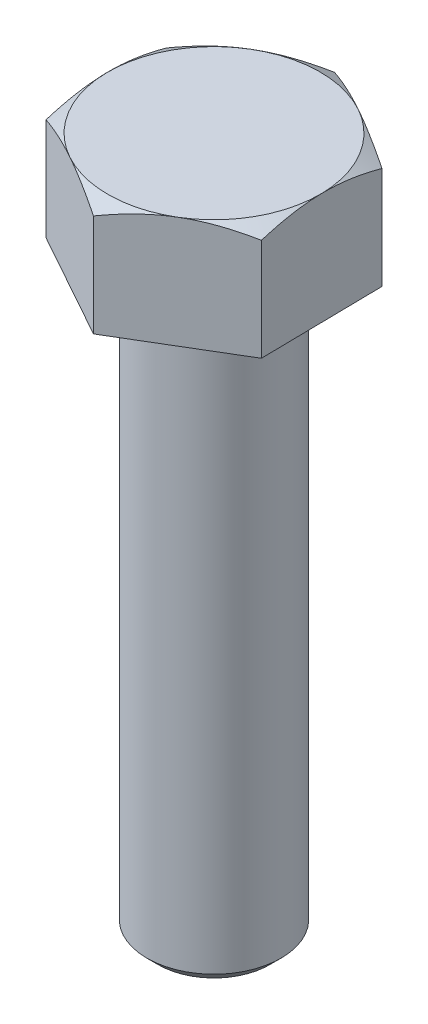
ISO-10303-21;
HEADER;
FILE_DESCRIPTION(('STEP AP214'),'2;1');
FILE_NAME('part.step','',(''),(''),'','','');
FILE_SCHEMA(('AUTOMOTIVE_DESIGN { 1 0 10303 214 1 1 1 1 }'));
ENDSEC;
DATA;
#1=APPLICATION_CONTEXT('core data for automotive mechanical design processes');
#2=APPLICATION_PROTOCOL_DEFINITION('international standard','automotive_design',2000,#1);
#3=PRODUCT_CONTEXT('',#1,'mechanical');
#4=PRODUCT('Part','Part','',(#3));
#5=PRODUCT_RELATED_PRODUCT_CATEGORY('part','',(#4));
#6=PRODUCT_DEFINITION_FORMATION('','',#4);
#7=PRODUCT_DEFINITION_CONTEXT('part definition',#1,'design');
#8=PRODUCT_DEFINITION('design','',#6,#7);
#9=PRODUCT_DEFINITION_SHAPE('','',#8);
#10=(LENGTH_UNIT() NAMED_UNIT(*) SI_UNIT(.MILLI.,.METRE.));
#11=(NAMED_UNIT(*) PLANE_ANGLE_UNIT() SI_UNIT($,.RADIAN.));
#12=(NAMED_UNIT(*) SI_UNIT($,.STERADIAN.) SOLID_ANGLE_UNIT());
#13=UNCERTAINTY_MEASURE_WITH_UNIT(LENGTH_MEASURE(1.E-05),#10,'distance_accuracy_value','');
#14=(GEOMETRIC_REPRESENTATION_CONTEXT(3) GLOBAL_UNCERTAINTY_ASSIGNED_CONTEXT((#13)) GLOBAL_UNIT_ASSIGNED_CONTEXT((#10,
#11,#12)) REPRESENTATION_CONTEXT('',''));
#15=CARTESIAN_POINT('',(0.,0.,0.));
#16=DIRECTION('',(0.,0.,1.));
#17=DIRECTION('',(1.,0.,0.));
#18=AXIS2_PLACEMENT_3D('',#15,#16,#17);
#19=CARTESIAN_POINT('',(0.173262347814132,10.,10.9682867163547));
#20=DIRECTION('',(-0.513616234425041,0.,-0.858020025252931));
#21=DIRECTION('',(-0.858020025252931,0.,0.513616234425041));
#22=AXIS2_PLACEMENT_3D('',#19,#20,#21);
#23=PLANE('',#22);
#24=CARTESIAN_POINT('',(0.173062347814132,9.15142693422508,10.9684064376245));
#25=CARTESIAN_POINT('',(0.379962741516676,9.22102596438326,10.8445545484063));
#26=CARTESIAN_POINT('',(0.587634567984237,9.28746612301292,10.7202408746375));
#27=CARTESIAN_POINT('',(1.00464359579951,9.41315220352887,10.4706166231235));
#28=CARTESIAN_POINT('',(1.21398132090291,9.47239575924445,10.345305731855));
#29=CARTESIAN_POINT('',(1.84536756822677,9.63818502077471,9.96735391572733));
#30=CARTESIAN_POINT('',(2.26990857494894,9.73248521216513,9.71322097382148));
#31=CARTESIAN_POINT('',(2.9052147574972,9.84306103598287,9.33292265958203));
#32=CARTESIAN_POINT('',(3.11408190838828,9.87455994336869,9.2078934570245));
#33=CARTESIAN_POINT('',(3.53278325536823,9.92738162471967,8.95725617251457));
#34=CARTESIAN_POINT('',(3.74261746999128,9.94870420282556,8.8316480794675));
#35=CARTESIAN_POINT('',(4.16263591942992,9.98062688939429,8.58022236906391));
#36=CARTESIAN_POINT('',(4.37281943958275,9.99123973986667,8.45440517950907));
#37=CARTESIAN_POINT('',(4.79338062734909,10.0015174586375,8.20265458249685));
#38=CARTESIAN_POINT('',(5.00375828876341,10.0011826651834,8.07672117875033));
#39=CARTESIAN_POINT('',(5.39706463451681,9.99032668992021,7.84128550319977));
#40=CARTESIAN_POINT('',(5.58002107805211,9.98112980288547,7.73176661456463));
#41=CARTESIAN_POINT('',(5.94550606922439,9.95463468405479,7.51298497849565));
#42=CARTESIAN_POINT('',(6.12803458567441,9.93733587917869,7.40372224973054));
#43=CARTESIAN_POINT('',(6.67491287959708,9.87369557628856,7.07635743102418));
#44=CARTESIAN_POINT('',(7.03829464318031,9.81561811884142,6.85883480034277));
#45=CARTESIAN_POINT('',(7.76891278231669,9.67042388406765,6.42148214378299));
#46=CARTESIAN_POINT('',(8.13605591494484,9.58269164706172,6.2017079337115));
#47=CARTESIAN_POINT('',(8.86486719183333,9.38357588040631,5.76543687636453));
#48=CARTESIAN_POINT('',(9.22654466877665,9.2722391164208,5.54893444248576));
#49=CARTESIAN_POINT('',(9.58564610626165,9.15142693422508,5.33397404218124));
#50=B_SPLINE_CURVE_WITH_KNOTS('',3,(#24,#25,#26,#27,#28,#29,#30,#31,#32,#33,#34,#35,#36,#37,#38,
#39,#40,#41,#42,#43,#44,#45,#46,#47,#48,#49),.UNSPECIFIED.,.F.,.F.,(4,2,2,2,2,2,2,2,2,2,2,2,4),
(0.,0.752880576986519,1.50600802735598,3.01546900018932,3.75167373176769,4.48789263217927,
5.22323457212509,5.95855379235702,6.59868189063848,7.23885527450938,8.52011176995212,
9.82978357664086,11.1368844914701),.UNSPECIFIED.);
#51=CARTESIAN_POINT('',(0.173262347814132,9.15149422396812,10.9682867163547));
#52=VERTEX_POINT('',#51);
#53=CARTESIAN_POINT('',(4.87935422703789,10.,8.15119023990285));
#54=VERTEX_POINT('',#53);
#55=EDGE_CURVE('E264',#52,#54,#50,.T.);
#56=ORIENTED_EDGE('',*,*,#55,.F.);
#57=DIRECTION('',(0.,-1.,0.));
#58=VECTOR('',#57,1.);
#59=CARTESIAN_POINT('',(0.173262347814132,10.,10.9682867163547));
#60=LINE('',#59,#58);
#61=CARTESIAN_POINT('',(0.173262347814132,0.,10.9682867163547));
#62=VERTEX_POINT('',#61);
#63=EDGE_CURVE('E247',#52,#62,#60,.T.);
#64=ORIENTED_EDGE('',*,*,#63,.T.);
#65=DIRECTION('',(0.858020025252931,0.,-0.513616234425041));
#66=VECTOR('',#65,1.);
#67=CARTESIAN_POINT('',(0.173262347814132,0.,10.9682867163547));
#68=LINE('',#67,#66);
#69=CARTESIAN_POINT('',(9.58544610626165,0.,5.33409376345098));
#70=VERTEX_POINT('',#69);
#71=EDGE_CURVE('E262',#62,#70,#68,.T.);
#72=ORIENTED_EDGE('',*,*,#71,.T.);
#73=DIRECTION('',(0.,-1.,0.));
#74=VECTOR('',#73,1.);
#75=CARTESIAN_POINT('',(9.58544610626165,10.,5.33409376345098));
#76=LINE('',#75,#74);
#77=CARTESIAN_POINT('',(9.58544610626165,9.15149422396812,5.33409376345098));
#78=VERTEX_POINT('',#77);
#79=EDGE_CURVE('E236',#78,#70,#76,.T.);
#80=ORIENTED_EDGE('',*,*,#79,.F.);
#81=EDGE_CURVE('E116',#54,#78,#50,.T.);
#82=ORIENTED_EDGE('',*,*,#81,.F.);
#83=EDGE_LOOP('',(#56,#64,#72,#80,#82));
#84=FACE_BOUND('',#83,.T.);
#85=ADVANCED_FACE('F40',(#84),#23,.F.);
#86=CARTESIAN_POINT('',(9.58544610626165,10.,5.33409376345098));
#87=DIRECTION('',(-0.999875256037325,0.,0.0157946941817238));
#88=DIRECTION('',(0.0157946941817238,0.,0.999875256037325));
#89=AXIS2_PLACEMENT_3D('',#86,#87,#88);
#90=PLANE('',#89);
#91=CARTESIAN_POINT('',(9.58544926559459,9.15143648094854,5.33429376345098));
#92=CARTESIAN_POINT('',(9.58164058447453,9.22103511610949,5.09318710027226));
#93=CARTESIAN_POINT('',(9.57781770260655,9.28747487018941,4.85118146581229));
#94=CARTESIAN_POINT('',(9.57014128223299,9.41316012408747,4.36522949370347));
#95=CARTESIAN_POINT('',(9.56628773408599,9.47240325773065,4.12128254570937));
#96=CARTESIAN_POINT('',(9.55466499762388,9.63819122352982,3.38551099722605));
#97=CARTESIAN_POINT('',(9.54684992710142,9.73249051890971,2.89078184643059));
#98=CARTESIAN_POINT('',(9.5351550319087,9.84306500762035,2.15044232541103));
#99=CARTESIAN_POINT('',(9.53131014626852,9.87456347834013,1.90704375310096));
#100=CARTESIAN_POINT('',(9.52360257359658,9.92738429049192,1.41911970024372));
#101=CARTESIAN_POINT('',(9.51973988622363,9.94870643605982,1.17459419809794));
#102=CARTESIAN_POINT('',(9.51200806843451,9.98062827285205,0.685135320161817));
#103=CARTESIAN_POINT('',(9.50813895117355,9.99124070591221,0.440202777155754));
#104=CARTESIAN_POINT('',(9.50039714301958,10.0015176151139,-0.0498885358562121));
#105=CARTESIAN_POINT('',(9.49652445224067,10.0011824295156,-0.295047298638313));
#106=CARTESIAN_POINT('',(9.48928439327191,9.9903258049719,-0.753375629141634));
#107=CARTESIAN_POINT('',(9.48591651401775,9.98112873985218,-0.966577549534346));
#108=CARTESIAN_POINT('',(9.47918863230238,9.95463345763731,-1.39248275386086));
#109=CARTESIAN_POINT('',(9.47582863041525,9.93733466749521,-1.60518600145308));
#110=CARTESIAN_POINT('',(9.46576164406384,9.87369468921491,-2.24247156328983));
#111=CARTESIAN_POINT('',(9.45907247879381,9.81561782212762,-2.665925842309));
#112=CARTESIAN_POINT('',(9.44562319355357,9.67042543153226,-3.51732615233592));
#113=CARTESIAN_POINT('',(9.43886478995831,9.58269447209229,-3.94516352908191));
#114=CARTESIAN_POINT('',(9.42544876533842,9.38358174595555,-4.79445829208811));
#115=CARTESIAN_POINT('',(9.41879097252436,9.27224674251197,-5.21592655339163));
#116=CARTESIAN_POINT('',(9.41218059911457,9.15143648094854,-5.63439295290374));
#117=B_SPLINE_CURVE_WITH_KNOTS('',3,(#91,#92,#93,#94,#95,#96,#97,#98,#99,#100,#101,#102,#103,
#104,#105,#106,#107,#108,#109,#110,#111,#112,#113,#114,#115,#116),.UNSPECIFIED.,.F.,.F.,(4,2,2,
2,2,2,2,2,2,2,2,2,4),(0.,0.752879445569665,1.50600576400105,3.01546441053545,3.7516681180122,
4.487885994658,5.2232269228263,5.95854513041304,6.59866590824933,7.23883196961019,
8.52007377521222,9.82973011484263,11.1368156722817),.UNSPECIFIED.);
#118=CARTESIAN_POINT('',(9.49881493235459,10.,-0.150049594726377));
#119=VERTEX_POINT('',#118);
#120=EDGE_CURVE('E112',#78,#119,#117,.T.);
#121=ORIENTED_EDGE('',*,*,#120,.F.);
#122=ORIENTED_EDGE('',*,*,#79,.T.);
#123=DIRECTION('',(-0.0157946941817238,0.,-0.999875256037325));
#124=VECTOR('',#123,1.);
#125=CARTESIAN_POINT('',(9.58544610626165,0.,5.33409376345098));
#126=LINE('',#125,#124);
#127=CARTESIAN_POINT('',(9.41218375844751,0.,-5.63419295290374));
#128=VERTEX_POINT('',#127);
#129=EDGE_CURVE('E261',#70,#128,#126,.T.);
#130=ORIENTED_EDGE('',*,*,#129,.T.);
#131=DIRECTION('',(0.,-1.,0.));
#132=VECTOR('',#131,1.);
#133=CARTESIAN_POINT('',(9.41218375844751,10.,-5.63419295290374));
#134=LINE('',#133,#132);
#135=CARTESIAN_POINT('',(9.41218375844751,9.15149422396812,-5.63419295290374));
#136=VERTEX_POINT('',#135);
#137=EDGE_CURVE('E140',#136,#128,#134,.T.);
#138=ORIENTED_EDGE('',*,*,#137,.F.);
#139=EDGE_CURVE('E120',#119,#136,#117,.T.);
#140=ORIENTED_EDGE('',*,*,#139,.F.);
#141=EDGE_LOOP('',(#121,#122,#130,#138,#140));
#142=FACE_BOUND('',#141,.T.);
#143=ADVANCED_FACE('F138',(#142),#90,.F.);
#144=CARTESIAN_POINT('',(9.41218375844751,10.,-5.63419295290374));
#145=DIRECTION('',(-0.486259021612283,0.,0.873814719434655));
#146=DIRECTION('',(0.873814719434655,0.,0.486259021612283));
#147=AXIS2_PLACEMENT_3D('',#144,#145,#146);
#148=PLANE('',#147);
#149=CARTESIAN_POINT('',(9.41238375844751,9.15142815054419,-5.63408165722267));
#150=CARTESIAN_POINT('',(9.20167471022813,9.22102713037708,-5.75133669236136));
#151=CARTESIAN_POINT('',(8.99018002862632,9.28746723746441,-5.86902891551187));
#152=CARTESIAN_POINT('',(8.56549463445454,9.41315321266372,-6.1053571664214));
#153=CARTESIAN_POINT('',(8.35230338848769,9.47239671460446,-6.22399349100427));
#154=CARTESIAN_POINT('',(7.70929448967796,9.6381858110499,-6.58181405761764));
#155=CARTESIAN_POINT('',(7.27693847137902,9.73248588828258,-6.82241084520923));
#156=CARTESIAN_POINT('',(6.62993748243662,9.8430615419987,-7.18245292377351));
#157=CARTESIAN_POINT('',(6.41722547339015,9.87456039375033,-7.30082256335916));
#158=CARTESIAN_POINT('',(5.99081661034819,9.92738196435948,-7.53810988747718));
#159=CARTESIAN_POINT('',(5.77711973747732,9.94870448735711,-7.65702758251329));
#160=CARTESIAN_POINT('',(5.3493695299224,9.98062706565855,-7.89506133588686));
#161=CARTESIAN_POINT('',(5.13531692305321,9.99123986294978,-8.01417698921108));
#162=CARTESIAN_POINT('',(4.70701398999777,10.001517478576,-8.25251832238976));
#163=CARTESIAN_POINT('',(4.49276367012479,10.0011826351601,-8.37174399873103));
#164=CARTESIAN_POINT('',(4.09221753237682,9.99032657717369,-8.59463927472033));
#165=CARTESIAN_POINT('',(3.90589344385083,9.98112966744938,-8.69832460637516));
#166=CARTESIAN_POINT('',(3.53368103921688,9.95463452780185,-8.90545277174454));
#167=CARTESIAN_POINT('',(3.34779275486982,9.93733572480273,-9.00889558778484));
#168=CARTESIAN_POINT('',(2.79084817618177,9.87369546326955,-9.31882321878233));
#169=CARTESIAN_POINT('',(2.42077771310676,9.81561808103811,-9.52475943992871));
#170=CARTESIAN_POINT('',(1.67671123342427,9.67042408122527,-9.9388163679912));
#171=CARTESIAN_POINT('',(1.30281017569789,9.58269200699015,-10.1468842323406));
#172=CARTESIAN_POINT('',(0.560583814947694,9.38357662771809,-10.5599171739541));
#173=CARTESIAN_POINT('',(0.192249007508687,9.27224008803796,-10.7648875402199));
#174=CARTESIAN_POINT('',(-0.173462347814133,9.15142815054419,-10.9683980120358));
#175=B_SPLINE_CURVE_WITH_KNOTS('',3,(#149,#150,#151,#152,#153,#154,#155,#156,#157,#158,#159,
#160,#161,#162,#163,#164,#165,#166,#167,#168,#169,#170,#171,#172,#173,#174),.UNSPECIFIED.,.F.,
.F.,(4,2,2,2,2,2,2,2,2,2,2,2,4),(0.,0.752880432836143,1.50600773898882,3.01546841543549,
3.75167301653617,4.48789178651286,5.22323359755117,5.95855268876504,6.59867985437287,
7.23885230530706,8.52010692916586,9.82977676524726,11.1368757234418),.UNSPECIFIED.);
#176=CARTESIAN_POINT('',(4.61946070531669,10.,-8.30123983462922));
#177=VERTEX_POINT('',#176);
#178=EDGE_CURVE('E127',#136,#177,#175,.T.);
#179=ORIENTED_EDGE('',*,*,#178,.F.);
#180=ORIENTED_EDGE('',*,*,#137,.T.);
#181=DIRECTION('',(-0.873814719434655,0.,-0.486259021612283));
#182=VECTOR('',#181,1.);
#183=CARTESIAN_POINT('',(9.41218375844751,0.,-5.63419295290374));
#184=LINE('',#183,#182);
#185=CARTESIAN_POINT('',(-0.173262347814132,0.,-10.9682867163547));
#186=VERTEX_POINT('',#185);
#187=EDGE_CURVE('E258',#128,#186,#184,.T.);
#188=ORIENTED_EDGE('',*,*,#187,.T.);
#189=DIRECTION('',(0.,-1.,0.));
#190=VECTOR('',#189,1.);
#191=CARTESIAN_POINT('',(-0.173262347814132,10.,-10.9682867163547));
#192=LINE('',#191,#190);
#193=CARTESIAN_POINT('',(-0.173262347814132,9.15149422396812,-10.9682867163547));
#194=VERTEX_POINT('',#193);
#195=EDGE_CURVE('E241',#194,#186,#192,.T.);
#196=ORIENTED_EDGE('',*,*,#195,.F.);
#197=EDGE_CURVE('E141',#177,#194,#175,.T.);
#198=ORIENTED_EDGE('',*,*,#197,.F.);
#199=EDGE_LOOP('',(#179,#180,#188,#196,#198));
#200=FACE_BOUND('',#199,.T.);
#201=ADVANCED_FACE('F201',(#200),#148,.F.);
#202=CARTESIAN_POINT('',(-0.173262347814132,10.,-10.9682867163547));
#203=DIRECTION('',(0.513616234425041,0.,0.858020025252931));
#204=DIRECTION('',(0.858020025252932,0.,-0.513616234425041));
#205=AXIS2_PLACEMENT_3D('',#202,#203,#204);
#206=PLANE('',#205);
#207=CARTESIAN_POINT('',(-0.173062347814132,9.15142693422508,-10.9684064376245));
#208=CARTESIAN_POINT('',(-0.379962741516677,9.22102596438325,-10.8445545484063));
#209=CARTESIAN_POINT('',(-0.587634567984237,9.28746612301292,-10.7202408746375));
#210=CARTESIAN_POINT('',(-1.00464359579951,9.41315220352887,-10.4706166231235));
#211=CARTESIAN_POINT('',(-1.21398132090291,9.47239575924445,-10.345305731855));
#212=CARTESIAN_POINT('',(-1.84536756822677,9.6381850207747,-9.96735391572733));
#213=CARTESIAN_POINT('',(-2.26990857494894,9.73248521216513,-9.71322097382148));
#214=CARTESIAN_POINT('',(-2.9052147574972,9.84306103598287,-9.33292265958203));
#215=CARTESIAN_POINT('',(-3.11408190838828,9.87455994336869,-9.2078934570245));
#216=CARTESIAN_POINT('',(-3.53278325536823,9.92738162471967,-8.95725617251457));
#217=CARTESIAN_POINT('',(-3.74261746999128,9.94870420282556,-8.8316480794675));
#218=CARTESIAN_POINT('',(-4.16263591942992,9.98062688939429,-8.58022236906391));
#219=CARTESIAN_POINT('',(-4.37281943958275,9.99123973986667,-8.45440517950907));
#220=CARTESIAN_POINT('',(-4.79338062734909,10.0015174586375,-8.20265458249685));
#221=CARTESIAN_POINT('',(-5.00375828876341,10.0011826651834,-8.07672117875033));
#222=CARTESIAN_POINT('',(-5.39706463451681,9.99032668992021,-7.84128550319977));
#223=CARTESIAN_POINT('',(-5.58002107805211,9.98112980288547,-7.73176661456463));
#224=CARTESIAN_POINT('',(-5.9455060692244,9.95463468405479,-7.51298497849566));
#225=CARTESIAN_POINT('',(-6.12803458567441,9.93733587917869,-7.40372224973054));
#226=CARTESIAN_POINT('',(-6.67491287959708,9.87369557628856,-7.07635743102418));
#227=CARTESIAN_POINT('',(-7.03829464318032,9.81561811884141,-6.85883480034277));
#228=CARTESIAN_POINT('',(-7.7689127823167,9.67042388406765,-6.42148214378299));
#229=CARTESIAN_POINT('',(-8.13605591494485,9.58269164706172,-6.2017079337115));
#230=CARTESIAN_POINT('',(-8.86486719183333,9.38357588040631,-5.76543687636453));
#231=CARTESIAN_POINT('',(-9.22654466877666,9.2722391164208,-5.54893444248576));
#232=CARTESIAN_POINT('',(-9.58564610626166,9.15142693422508,-5.33397404218124));
#233=B_SPLINE_CURVE_WITH_KNOTS('',3,(#207,#208,#209,#210,#211,#212,#213,#214,#215,#216,#217,
#218,#219,#220,#221,#222,#223,#224,#225,#226,#227,#228,#229,#230,#231,#232),.UNSPECIFIED.,.F.,
.F.,(4,2,2,2,2,2,2,2,2,2,2,2,4),(0.,0.752880576986519,1.50600802735598,3.01546900018932,
3.75167373176769,4.48789263217928,5.22323457212509,5.95855379235702,6.59868189063848,
7.23885527450938,8.52011176995212,9.82978357664086,11.1368844914701),.UNSPECIFIED.);
#234=CARTESIAN_POINT('',(-4.87935422703789,10.,-8.15119023990285));
#235=VERTEX_POINT('',#234);
#236=EDGE_CURVE('E195',#194,#235,#233,.T.);
#237=ORIENTED_EDGE('',*,*,#236,.F.);
#238=ORIENTED_EDGE('',*,*,#195,.T.);
#239=DIRECTION('',(-0.858020025252931,0.,0.513616234425041));
#240=VECTOR('',#239,1.);
#241=CARTESIAN_POINT('',(-0.173262347814132,0.,-10.9682867163547));
#242=LINE('',#241,#240);
#243=CARTESIAN_POINT('',(-9.58544610626166,0.,-5.33409376345098));
#244=VERTEX_POINT('',#243);
#245=EDGE_CURVE('E255',#186,#244,#242,.T.);
#246=ORIENTED_EDGE('',*,*,#245,.T.);
#247=DIRECTION('',(0.,-1.,0.));
#248=VECTOR('',#247,1.);
#249=CARTESIAN_POINT('',(-9.58544610626166,10.,-5.33409376345098));
#250=LINE('',#249,#248);
#251=CARTESIAN_POINT('',(-9.58544610626166,9.15149422396812,-5.33409376345098));
#252=VERTEX_POINT('',#251);
#253=EDGE_CURVE('E243',#252,#244,#250,.T.);
#254=ORIENTED_EDGE('',*,*,#253,.F.);
#255=EDGE_CURVE('E189',#235,#252,#233,.T.);
#256=ORIENTED_EDGE('',*,*,#255,.F.);
#257=EDGE_LOOP('',(#237,#238,#246,#254,#256));
#258=FACE_BOUND('',#257,.T.);
#259=ADVANCED_FACE('F197',(#258),#206,.F.);
#260=CARTESIAN_POINT('',(-9.58544610626166,10.,-5.33409376345098));
#261=DIRECTION('',(0.999875256037325,0.,-0.0157946941817239));
#262=DIRECTION('',(-0.0157946941817238,0.,-0.999875256037325));
#263=AXIS2_PLACEMENT_3D('',#260,#261,#262);
#264=PLANE('',#263);
#265=CARTESIAN_POINT('',(-9.5854492655946,9.15143648094854,-5.33429376345098));
#266=CARTESIAN_POINT('',(-9.58164058447454,9.22103511610948,-5.09318710027226));
#267=CARTESIAN_POINT('',(-9.57781770260656,9.2874748701894,-4.85118146581229));
#268=CARTESIAN_POINT('',(-9.570141282233,9.41316012408746,-4.36522949370347));
#269=CARTESIAN_POINT('',(-9.566287734086,9.47240325773064,-4.12128254570938));
#270=CARTESIAN_POINT('',(-9.55466499762389,9.63819122352981,-3.38551099722605));
#271=CARTESIAN_POINT('',(-9.54684992710142,9.73249051890971,-2.89078184643059));
#272=CARTESIAN_POINT('',(-9.53515503190871,9.84306500762035,-2.15044232541103));
#273=CARTESIAN_POINT('',(-9.53131014626853,9.87456347834013,-1.90704375310095));
#274=CARTESIAN_POINT('',(-9.52360257359659,9.92738429049192,-1.41911970024372));
#275=CARTESIAN_POINT('',(-9.51973988622363,9.94870643605981,-1.17459419809794));
#276=CARTESIAN_POINT('',(-9.51200806843451,9.98062827285204,-0.685135320161816));
#277=CARTESIAN_POINT('',(-9.50813895117356,9.99124070591221,-0.440202777155752));
#278=CARTESIAN_POINT('',(-9.50039714301959,10.0015176151139,0.0498885358562139));
#279=CARTESIAN_POINT('',(-9.49652445224068,10.0011824295156,0.295047298638315));
#280=CARTESIAN_POINT('',(-9.48928439327192,9.9903258049719,0.753375629141636));
#281=CARTESIAN_POINT('',(-9.48591651401775,9.98112873985218,0.966577549534348));
#282=CARTESIAN_POINT('',(-9.47918863230239,9.9546334576373,1.39248275386086));
#283=CARTESIAN_POINT('',(-9.47582863041526,9.93733466749521,1.60518600145308));
#284=CARTESIAN_POINT('',(-9.46576164406385,9.87369468921491,2.24247156328983));
#285=CARTESIAN_POINT('',(-9.45907247879381,9.81561782212762,2.665925842309));
#286=CARTESIAN_POINT('',(-9.44562319355358,9.67042543153226,3.51732615233592));
#287=CARTESIAN_POINT('',(-9.43886478995832,9.58269447209229,3.94516352908191));
#288=CARTESIAN_POINT('',(-9.42544876533842,9.38358174595555,4.79445829208811));
#289=CARTESIAN_POINT('',(-9.41879097252437,9.27224674251196,5.21592655339163));
#290=CARTESIAN_POINT('',(-9.41218059911458,9.15143648094854,5.63439295290373));
#291=B_SPLINE_CURVE_WITH_KNOTS('',3,(#265,#266,#267,#268,#269,#270,#271,#272,#273,#274,#275,
#276,#277,#278,#279,#280,#281,#282,#283,#284,#285,#286,#287,#288,#289,#290),.UNSPECIFIED.,.F.,
.F.,(4,2,2,2,2,2,2,2,2,2,2,2,4),(0.,0.752879445569664,1.50600576400105,3.01546441053545,
3.7516681180122,4.48788599465801,5.2232269228263,5.95854513041304,6.59866590824933,
7.23883196961019,8.52007377521222,9.82973011484263,11.1368156722817),.UNSPECIFIED.);
#292=CARTESIAN_POINT('',(-9.49881493235459,10.,0.150049594726377));
#293=VERTEX_POINT('',#292);
#294=EDGE_CURVE('E196',#252,#293,#291,.T.);
#295=ORIENTED_EDGE('',*,*,#294,.F.);
#296=ORIENTED_EDGE('',*,*,#253,.T.);
#297=DIRECTION('',(0.0157946941817239,0.,0.999875256037325));
#298=VECTOR('',#297,1.);
#299=CARTESIAN_POINT('',(-9.58544610626166,0.,-5.33409376345098));
#300=LINE('',#299,#298);
#301=CARTESIAN_POINT('',(-9.41218375844752,0.,5.63419295290373));
#302=VERTEX_POINT('',#301);
#303=EDGE_CURVE('E252',#244,#302,#300,.T.);
#304=ORIENTED_EDGE('',*,*,#303,.T.);
#305=DIRECTION('',(0.,-1.,0.));
#306=VECTOR('',#305,1.);
#307=CARTESIAN_POINT('',(-9.41218375844752,10.,5.63419295290373));
#308=LINE('',#307,#306);
#309=CARTESIAN_POINT('',(-9.41218375844752,9.15149422396812,5.63419295290373));
#310=VERTEX_POINT('',#309);
#311=EDGE_CURVE('E245',#310,#302,#308,.T.);
#312=ORIENTED_EDGE('',*,*,#311,.F.);
#313=EDGE_CURVE('E182',#293,#310,#291,.T.);
#314=ORIENTED_EDGE('',*,*,#313,.F.);
#315=EDGE_LOOP('',(#295,#296,#304,#312,#314));
#316=FACE_BOUND('',#315,.T.);
#317=ADVANCED_FACE('F200',(#316),#264,.F.);
#318=CARTESIAN_POINT('',(-9.41218375844752,10.,5.63419295290373));
#319=DIRECTION('',(0.486259021612283,0.,-0.873814719434655));
#320=DIRECTION('',(-0.873814719434655,0.,-0.486259021612283));
#321=AXIS2_PLACEMENT_3D('',#318,#319,#320);
#322=PLANE('',#321);
#323=CARTESIAN_POINT('',(-9.41238375844752,9.15142815054419,5.63408165722267));
#324=CARTESIAN_POINT('',(-9.20167471022814,9.22102713037708,5.75133669236136));
#325=CARTESIAN_POINT('',(-8.99018002862632,9.28746723746441,5.86902891551186));
#326=CARTESIAN_POINT('',(-8.56549463445455,9.41315321266372,6.10535716642139));
#327=CARTESIAN_POINT('',(-8.3523033884877,9.47239671460446,6.22399349100427));
#328=CARTESIAN_POINT('',(-7.70929448967796,9.6381858110499,6.58181405761764));
#329=CARTESIAN_POINT('',(-7.27693847137902,9.73248588828258,6.82241084520923));
#330=CARTESIAN_POINT('',(-6.62993748243662,9.8430615419987,7.1824529237735));
#331=CARTESIAN_POINT('',(-6.41722547339015,9.87456039375033,7.30082256335916));
#332=CARTESIAN_POINT('',(-5.99081661034819,9.92738196435948,7.53810988747718));
#333=CARTESIAN_POINT('',(-5.77711973747732,9.94870448735711,7.65702758251329));
#334=CARTESIAN_POINT('',(-5.34936952992241,9.98062706565855,7.89506133588686));
#335=CARTESIAN_POINT('',(-5.13531692305321,9.99123986294978,8.01417698921107));
#336=CARTESIAN_POINT('',(-4.70701398999777,10.001517478576,8.25251832238976));
#337=CARTESIAN_POINT('',(-4.49276367012479,10.0011826351601,8.37174399873103));
#338=CARTESIAN_POINT('',(-4.09221753237682,9.9903265771737,8.59463927472033));
#339=CARTESIAN_POINT('',(-3.90589344385083,9.98112966744938,8.69832460637516));
#340=CARTESIAN_POINT('',(-3.53368103921688,9.95463452780185,8.90545277174454));
#341=CARTESIAN_POINT('',(-3.34779275486982,9.93733572480273,9.00889558778484));
#342=CARTESIAN_POINT('',(-2.79084817618178,9.87369546326955,9.31882321878232));
#343=CARTESIAN_POINT('',(-2.42077771310677,9.81561808103812,9.5247594399287));
#344=CARTESIAN_POINT('',(-1.67671123342427,9.67042408122527,9.9388163679912));
#345=CARTESIAN_POINT('',(-1.3028101756979,9.58269200699015,10.1468842323406));
#346=CARTESIAN_POINT('',(-0.560583814947695,9.3835766277181,10.559917173954));
#347=CARTESIAN_POINT('',(-0.192249007508689,9.27224008803796,10.7648875402199));
#348=CARTESIAN_POINT('',(0.173462347814132,9.15142815054419,10.9683980120358));
#349=B_SPLINE_CURVE_WITH_KNOTS('',3,(#323,#324,#325,#326,#327,#328,#329,#330,#331,#332,#333,
#334,#335,#336,#337,#338,#339,#340,#341,#342,#343,#344,#345,#346,#347,#348),.UNSPECIFIED.,.F.,
.F.,(4,2,2,2,2,2,2,2,2,2,2,2,4),(0.,0.752880432836145,1.50600773898882,3.0154684154355,
3.75167301653618,4.48789178651286,5.22323359755117,5.95855268876504,6.59867985437287,
7.23885230530707,8.52010692916587,9.82977676524727,11.1368757234418),.UNSPECIFIED.);
#350=CARTESIAN_POINT('',(-4.61946070531669,10.,8.30123983462922));
#351=VERTEX_POINT('',#350);
#352=EDGE_CURVE('E290',#310,#351,#349,.T.);
#353=ORIENTED_EDGE('',*,*,#352,.F.);
#354=ORIENTED_EDGE('',*,*,#311,.T.);
#355=DIRECTION('',(0.873814719434655,0.,0.486259021612283));
#356=VECTOR('',#355,1.);
#357=CARTESIAN_POINT('',(-9.41218375844752,0.,5.63419295290373));
#358=LINE('',#357,#356);
#359=EDGE_CURVE('E249',#302,#62,#358,.T.);
#360=ORIENTED_EDGE('',*,*,#359,.T.);
#361=ORIENTED_EDGE('',*,*,#63,.F.);
#362=EDGE_CURVE('E135',#351,#52,#349,.T.);
#363=ORIENTED_EDGE('',*,*,#362,.F.);
#364=EDGE_LOOP('',(#353,#354,#360,#361,#363));
#365=FACE_BOUND('',#364,.T.);
#366=ADVANCED_FACE('F222',(#365),#322,.F.);
#367=CARTESIAN_POINT('',(0.,-52.,0.));
#368=DIRECTION('',(0.,1.,0.));
#369=DIRECTION('',(0.,0.,1.));
#370=AXIS2_PLACEMENT_3D('',#367,#368,#369);
#371=CYLINDRICAL_SURFACE('',#370,6.);
#372=CARTESIAN_POINT('',(0.,-51.,0.));
#373=DIRECTION('',(0.,1.,0.));
#374=DIRECTION('',(0.,0.,1.));
#375=AXIS2_PLACEMENT_3D('',#372,#373,#374);
#376=CIRCLE('',#375,6.);
#377=CARTESIAN_POINT('',(0.,-51.,6.));
#378=VERTEX_POINT('',#377);
#379=EDGE_CURVE('E49',#378,#378,#376,.T.);
#380=ORIENTED_EDGE('',*,*,#379,.T.);
#381=EDGE_LOOP('',(#380));
#382=FACE_BOUND('',#381,.T.);
#383=CARTESIAN_POINT('',(0.,0.,0.));
#384=DIRECTION('',(0.,1.,0.));
#385=DIRECTION('',(0.,0.,1.));
#386=AXIS2_PLACEMENT_3D('',#383,#384,#385);
#387=CIRCLE('',#386,6.);
#388=CARTESIAN_POINT('',(0.,0.,6.));
#389=VERTEX_POINT('',#388);
#390=EDGE_CURVE('E234',#389,#389,#387,.T.);
#391=ORIENTED_EDGE('',*,*,#390,.F.);
#392=EDGE_LOOP('',(#391));
#393=FACE_BOUND('',#392,.T.);
#394=ADVANCED_FACE('F219',(#382,#393),#371,.T.);
#395=CARTESIAN_POINT('',(0.,-52.,0.));
#396=DIRECTION('',(0.,1.,0.));
#397=DIRECTION('',(0.,0.,1.));
#398=AXIS2_PLACEMENT_3D('',#395,#396,#397);
#399=PLANE('',#398);
#400=CARTESIAN_POINT('',(0.,-52.,0.));
#401=DIRECTION('',(0.,1.,0.));
#402=DIRECTION('',(0.,0.,1.));
#403=AXIS2_PLACEMENT_3D('',#400,#401,#402);
#404=CIRCLE('',#403,4.99999999999998);
#405=CARTESIAN_POINT('',(0.,-52.,4.99999999999998));
#406=VERTEX_POINT('',#405);
#407=EDGE_CURVE('E13',#406,#406,#404,.F.);
#408=ORIENTED_EDGE('',*,*,#407,.T.);
#409=EDGE_LOOP('',(#408));
#410=FACE_BOUND('',#409,.T.);
#411=ADVANCED_FACE('F217',(#410),#399,.F.);
#412=CARTESIAN_POINT('',(0.,0.,0.));
#413=DIRECTION('',(0.,1.,0.));
#414=DIRECTION('',(0.,0.,1.));
#415=AXIS2_PLACEMENT_3D('',#412,#413,#414);
#416=PLANE('',#415);
#417=ORIENTED_EDGE('',*,*,#390,.T.);
#418=EDGE_LOOP('',(#417));
#419=FACE_BOUND('',#418,.T.);
#420=ORIENTED_EDGE('',*,*,#71,.F.);
#421=ORIENTED_EDGE('',*,*,#359,.F.);
#422=ORIENTED_EDGE('',*,*,#303,.F.);
#423=ORIENTED_EDGE('',*,*,#245,.F.);
#424=ORIENTED_EDGE('',*,*,#187,.F.);
#425=ORIENTED_EDGE('',*,*,#129,.F.);
#426=EDGE_LOOP('',(#420,#421,#422,#423,#424,#425));
#427=FACE_BOUND('',#426,.T.);
#428=ADVANCED_FACE('F168',(#419,#427),#416,.F.);
#429=CARTESIAN_POINT('',(0.,10.,0.));
#430=DIRECTION('',(0.,-1.,0.));
#431=DIRECTION('',(0.,0.,1.));
#432=AXIS2_PLACEMENT_3D('',#429,#430,#431);
#433=CONICAL_SURFACE('',#432,9.5,1.0471975511966);
#434=ORIENTED_EDGE('',*,*,#55,.T.);
#435=CARTESIAN_POINT('',(0.,10.,0.));
#436=DIRECTION('',(0.,1.,0.));
#437=DIRECTION('',(0.,0.,1.));
#438=AXIS2_PLACEMENT_3D('',#435,#436,#437);
#439=CIRCLE('',#438,9.5);
#440=EDGE_CURVE('E133',#351,#54,#439,.T.);
#441=ORIENTED_EDGE('',*,*,#440,.F.);
#442=ORIENTED_EDGE('',*,*,#362,.T.);
#443=EDGE_LOOP('',(#434,#441,#442));
#444=FACE_BOUND('',#443,.T.);
#445=ADVANCED_FACE('F163',(#444),#433,.T.);
#446=ORIENTED_EDGE('',*,*,#313,.T.);
#447=ORIENTED_EDGE('',*,*,#352,.T.);
#448=EDGE_CURVE('E64',#293,#351,#439,.T.);
#449=ORIENTED_EDGE('',*,*,#448,.F.);
#450=EDGE_LOOP('',(#446,#447,#449));
#451=FACE_BOUND('',#450,.T.);
#452=ADVANCED_FACE('F167',(#451),#433,.T.);
#453=ORIENTED_EDGE('',*,*,#255,.T.);
#454=ORIENTED_EDGE('',*,*,#294,.T.);
#455=EDGE_CURVE('E284',#235,#293,#439,.T.);
#456=ORIENTED_EDGE('',*,*,#455,.F.);
#457=EDGE_LOOP('',(#453,#454,#456));
#458=FACE_BOUND('',#457,.T.);
#459=ADVANCED_FACE('F285',(#458),#433,.T.);
#460=ORIENTED_EDGE('',*,*,#197,.T.);
#461=ORIENTED_EDGE('',*,*,#236,.T.);
#462=EDGE_CURVE('E131',#177,#235,#439,.T.);
#463=ORIENTED_EDGE('',*,*,#462,.F.);
#464=EDGE_LOOP('',(#460,#461,#463));
#465=FACE_BOUND('',#464,.T.);
#466=ADVANCED_FACE('F281',(#465),#433,.T.);
#467=ORIENTED_EDGE('',*,*,#139,.T.);
#468=ORIENTED_EDGE('',*,*,#178,.T.);
#469=EDGE_CURVE('E124',#119,#177,#439,.T.);
#470=ORIENTED_EDGE('',*,*,#469,.F.);
#471=EDGE_LOOP('',(#467,#468,#470));
#472=FACE_BOUND('',#471,.T.);
#473=ADVANCED_FACE('F125',(#472),#433,.T.);
#474=ORIENTED_EDGE('',*,*,#81,.T.);
#475=ORIENTED_EDGE('',*,*,#120,.T.);
#476=CARTESIAN_POINT('',(0.,10.,0.));
#477=DIRECTION('',(0.,1.,0.));
#478=DIRECTION('',(0.,0.,1.));
#479=AXIS2_PLACEMENT_3D('',#476,#477,#478);
#480=CIRCLE('',#479,9.5);
#481=EDGE_CURVE('E56',#54,#119,#480,.T.);
#482=ORIENTED_EDGE('',*,*,#481,.F.);
#483=EDGE_LOOP('',(#474,#475,#482));
#484=FACE_BOUND('',#483,.T.);
#485=ADVANCED_FACE('F114',(#484),#433,.T.);
#486=CARTESIAN_POINT('',(0.,10.,0.));
#487=DIRECTION('',(0.,1.,0.));
#488=DIRECTION('',(0.,0.,1.));
#489=AXIS2_PLACEMENT_3D('',#486,#487,#488);
#490=PLANE('',#489);
#491=ORIENTED_EDGE('',*,*,#440,.T.);
#492=ORIENTED_EDGE('',*,*,#481,.T.);
#493=ORIENTED_EDGE('',*,*,#469,.T.);
#494=ORIENTED_EDGE('',*,*,#462,.T.);
#495=ORIENTED_EDGE('',*,*,#455,.T.);
#496=ORIENTED_EDGE('',*,*,#448,.T.);
#497=EDGE_LOOP('',(#491,#492,#493,#494,#495,#496));
#498=FACE_BOUND('',#497,.T.);
#499=ADVANCED_FACE('F134',(#498),#490,.T.);
#500=CARTESIAN_POINT('',(0.,-51.,0.));
#501=DIRECTION('',(0.,1.,0.));
#502=DIRECTION('',(0.,0.,1.));
#503=AXIS2_PLACEMENT_3D('',#500,#501,#502);
#504=CONICAL_SURFACE('',#503,6.,0.785398163397453);
#505=ORIENTED_EDGE('',*,*,#407,.F.);
#506=EDGE_LOOP('',(#505));
#507=FACE_BOUND('',#506,.T.);
#508=ORIENTED_EDGE('',*,*,#379,.F.);
#509=EDGE_LOOP('',(#508));
#510=FACE_BOUND('',#509,.T.);
#511=ADVANCED_FACE('F43',(#507,#510),#504,.T.);
#512=CLOSED_SHELL('',(#85,#143,#201,#259,#317,#366,#394,#411,#428,#445,#452,#459,#466,#473,#485,
#499,#511));
#513=MANIFOLD_SOLID_BREP('B2',#512);
#514=ADVANCED_BREP_SHAPE_REPRESENTATION('',(#18,#513),#14);
#515=SHAPE_DEFINITION_REPRESENTATION(#9,#514);
ENDSEC;
END-ISO-10303-21;
